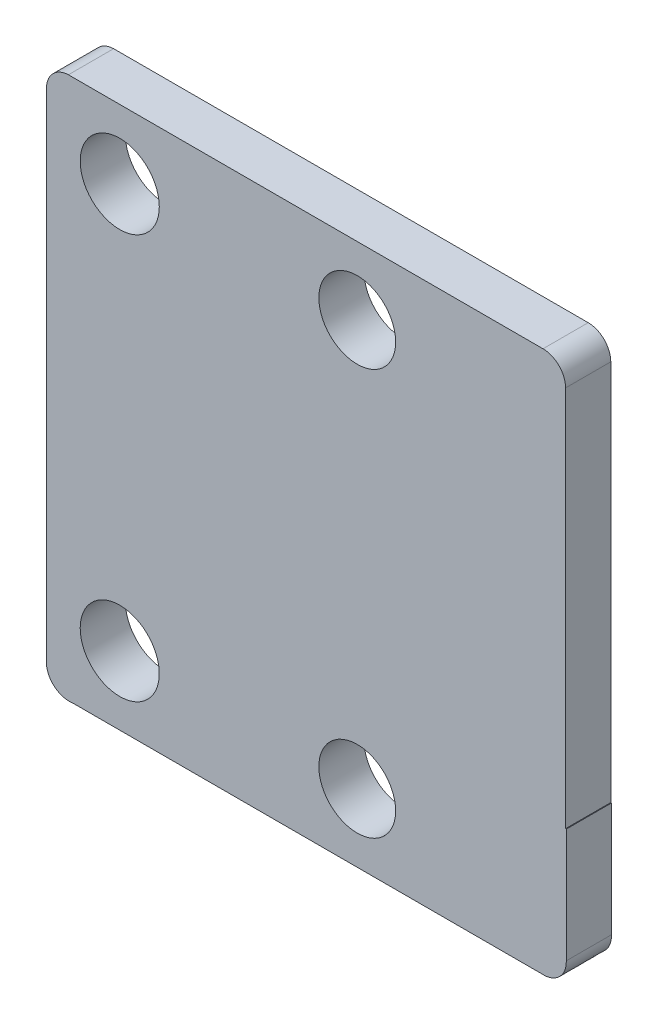
ISO-10303-21;
HEADER;
FILE_DESCRIPTION(('STEP AP214'),'2;1');
FILE_NAME('part.step','',(''),(''),'','','');
FILE_SCHEMA(('AUTOMOTIVE_DESIGN { 1 0 10303 214 1 1 1 1 }'));
ENDSEC;
DATA;
#1=APPLICATION_CONTEXT('core data for automotive mechanical design processes');
#2=APPLICATION_PROTOCOL_DEFINITION('international standard','automotive_design',2000,#1);
#3=PRODUCT_CONTEXT('',#1,'mechanical');
#4=PRODUCT('Part','Part','',(#3));
#5=PRODUCT_RELATED_PRODUCT_CATEGORY('part','',(#4));
#6=PRODUCT_DEFINITION_FORMATION('','',#4);
#7=PRODUCT_DEFINITION_CONTEXT('part definition',#1,'design');
#8=PRODUCT_DEFINITION('design','',#6,#7);
#9=PRODUCT_DEFINITION_SHAPE('','',#8);
#10=(LENGTH_UNIT() NAMED_UNIT(*) SI_UNIT(.MILLI.,.METRE.));
#11=(NAMED_UNIT(*) PLANE_ANGLE_UNIT() SI_UNIT($,.RADIAN.));
#12=(NAMED_UNIT(*) SI_UNIT($,.STERADIAN.) SOLID_ANGLE_UNIT());
#13=UNCERTAINTY_MEASURE_WITH_UNIT(LENGTH_MEASURE(1.E-05),#10,'distance_accuracy_value','');
#14=(GEOMETRIC_REPRESENTATION_CONTEXT(3) GLOBAL_UNCERTAINTY_ASSIGNED_CONTEXT((#13)) GLOBAL_UNIT_ASSIGNED_CONTEXT((#10,
#11,#12)) REPRESENTATION_CONTEXT('',''));
#15=CARTESIAN_POINT('',(0.,0.,0.));
#16=DIRECTION('',(0.,0.,1.));
#17=DIRECTION('',(1.,0.,0.));
#18=AXIS2_PLACEMENT_3D('',#15,#16,#17);
#19=CARTESIAN_POINT('',(3.38796219903326,76.09692360159,2.));
#20=DIRECTION('',(0.,0.,-1.));
#21=DIRECTION('',(-1.,0.,0.));
#22=AXIS2_PLACEMENT_3D('',#19,#20,#21);
#23=PLANE('',#22);
#24=CARTESIAN_POINT('',(4.13111112201128,75.9013919559706,2.));
#25=CARTESIAN_POINT('',(3.99969238475071,75.8828748631434,2.));
#26=CARTESIAN_POINT('',(3.86699746059071,75.8909909502416,2.));
#27=CARTESIAN_POINT('',(3.61249117013596,75.9581464715832,2.));
#28=CARTESIAN_POINT('',(3.49205618357225,76.0173859697303,2.));
#29=CARTESIAN_POINT('',(3.28386821449427,76.1764612334496,2.));
#30=CARTESIAN_POINT('',(3.19480496690169,76.2775755298951,2.));
#31=CARTESIAN_POINT('',(3.06289000640243,76.5035715896642,2.));
#32=CARTESIAN_POINT('',(3.01849844248715,76.6305174648622,2.));
#33=CARTESIAN_POINT('',(2.99998642645625,76.7619001712909,2.));
#34=B_SPLINE_CURVE_WITH_KNOTS('',3,(#24,#25,#26,#27,#28,#29,#30,#31,#32,#33),.UNSPECIFIED.,.F.,
.F.,(4,2,2,2,4),(0.,0.250000000000002,0.500000000000005,0.750000000000002,1.),.UNSPECIFIED.);
#35=CARTESIAN_POINT('',(2.99998642645625,76.7619001712909,2.));
#36=VERTEX_POINT('',#35);
#37=CARTESIAN_POINT('',(4.13111112201128,75.9013919559706,2.));
#38=VERTEX_POINT('',#37);
#39=EDGE_CURVE('E222',#36,#38,#34,.F.);
#40=ORIENTED_EDGE('',*,*,#39,.T.);
#41=DIRECTION('',(0.999999999999774,-6.72708715970015E-07,0.));
#42=VECTOR('',#41,1.);
#43=CARTESIAN_POINT('',(4.13111112201128,75.9013919559706,2.));
#44=LINE('',#43,#42);
#45=CARTESIAN_POINT('',(25.0323437963,75.9013778955292,2.));
#46=VERTEX_POINT('',#45);
#47=EDGE_CURVE('E111',#38,#46,#44,.T.);
#48=ORIENTED_EDGE('',*,*,#47,.T.);
#49=CARTESIAN_POINT('',(25.9999865478393,76.9423317710307,2.));
#50=CARTESIAN_POINT('',(26.0041729084957,76.8096950741571,2.));
#51=CARTESIAN_POINT('',(25.9826189370078,76.6787825227222,2.));
#52=CARTESIAN_POINT('',(25.8908073271444,76.4318223926162,2.));
#53=CARTESIAN_POINT('',(25.8206917841465,76.3176968614532,2.));
#54=CARTESIAN_POINT('',(25.5537117648207,76.0288568164609,2.));
#55=CARTESIAN_POINT('',(25.2976920535846,75.9097529797314,2.));
#56=CARTESIAN_POINT('',(25.0323437963,75.9013778955292,2.));
#57=B_SPLINE_CURVE_WITH_KNOTS('',3,(#49,#50,#51,#52,#53,#54,#55,#56),.UNSPECIFIED.,.F.,.F.,(4,2,
2,4),(0.,0.25,0.5,1.),.UNSPECIFIED.);
#58=CARTESIAN_POINT('',(25.9999865478393,76.9423317710307,2.));
#59=VERTEX_POINT('',#58);
#60=EDGE_CURVE('E185',#46,#59,#57,.F.);
#61=ORIENTED_EDGE('',*,*,#60,.T.);
#62=DIRECTION('',(6.72708715570576E-07,0.999999999999774,0.));
#63=VECTOR('',#62,1.);
#64=CARTESIAN_POINT('',(25.9999865478393,76.9423317710307,2.));
#65=LINE('',#64,#63);
#66=CARTESIAN_POINT('',(25.9999899447888,81.9919905042394,2.));
#67=VERTEX_POINT('',#66);
#68=EDGE_CURVE('E260',#59,#67,#65,.T.);
#69=ORIENTED_EDGE('',*,*,#68,.T.);
#70=DIRECTION('',(-0.999999988802901,-0.000149646911254807,0.));
#71=VECTOR('',#70,1.);
#72=CARTESIAN_POINT('',(25.9999899447888,81.9919905042394,2.));
#73=LINE('',#72,#71);
#74=CARTESIAN_POINT('',(25.9695999415119,81.9919859564692,2.));
#75=VERTEX_POINT('',#74);
#76=EDGE_CURVE('E276',#67,#75,#73,.T.);
#77=ORIENTED_EDGE('',*,*,#76,.T.);
#78=DIRECTION('',(0.,1.,0.));
#79=VECTOR('',#78,1.);
#80=CARTESIAN_POINT('',(25.9695999415119,81.9919859564692,2.));
#81=LINE('',#80,#79);
#82=CARTESIAN_POINT('',(25.9695999415119,98.8823008252965,2.));
#83=VERTEX_POINT('',#82);
#84=EDGE_CURVE('E313',#75,#83,#81,.T.);
#85=ORIENTED_EDGE('',*,*,#84,.T.);
#86=CARTESIAN_POINT('',(24.9695999415119,98.8823008252965,2.));
#87=DIRECTION('',(0.,0.,1.));
#88=DIRECTION('',(1.,0.,0.));
#89=AXIS2_PLACEMENT_3D('',#86,#87,#88);
#90=CIRCLE('',#89,1.);
#91=CARTESIAN_POINT('',(24.9695999415119,99.8823008252965,2.));
#92=VERTEX_POINT('',#91);
#93=EDGE_CURVE('E315',#83,#92,#90,.T.);
#94=ORIENTED_EDGE('',*,*,#93,.T.);
#95=DIRECTION('',(-1.,0.,0.));
#96=VECTOR('',#95,1.);
#97=CARTESIAN_POINT('',(24.9695999415119,99.8823008252965,2.));
#98=LINE('',#97,#96);
#99=CARTESIAN_POINT('',(3.96959994151188,99.8823008252966,2.));
#100=VERTEX_POINT('',#99);
#101=EDGE_CURVE('E139',#92,#100,#98,.T.);
#102=ORIENTED_EDGE('',*,*,#101,.T.);
#103=CARTESIAN_POINT('',(3.99998994246822,98.8827627080435,2.));
#104=DIRECTION('',(0.,0.,1.));
#105=DIRECTION('',(1.,0.,0.));
#106=AXIS2_PLACEMENT_3D('',#103,#104,#105);
#107=CIRCLE('',#106,1.);
#108=CARTESIAN_POINT('',(2.99998994246822,98.8827627080435,2.));
#109=VERTEX_POINT('',#108);
#110=EDGE_CURVE('E133',#100,#109,#107,.T.);
#111=ORIENTED_EDGE('',*,*,#110,.T.);
#112=DIRECTION('',(0.,-1.,0.));
#113=VECTOR('',#112,1.);
#114=CARTESIAN_POINT('',(2.99998994246822,98.8827627080435,2.));
#115=LINE('',#114,#113);
#116=CARTESIAN_POINT('',(2.99998994246822,81.9885486252381,2.));
#117=VERTEX_POINT('',#116);
#118=EDGE_CURVE('E137',#109,#117,#115,.T.);
#119=ORIENTED_EDGE('',*,*,#118,.T.);
#120=DIRECTION('',(-6.72708715473246E-07,-0.999999999999774,0.));
#121=VECTOR('',#120,1.);
#122=CARTESIAN_POINT('',(2.99998994246822,81.9885486252381,2.));
#123=LINE('',#122,#121);
#124=EDGE_CURVE('E59',#117,#36,#123,.T.);
#125=ORIENTED_EDGE('',*,*,#124,.T.);
#126=EDGE_LOOP('',(#40,#48,#61,#69,#77,#85,#94,#102,#111,#119,#125));
#127=FACE_BOUND('',#126,.T.);
#128=CARTESIAN_POINT('',(6.24052422757774,96.8357479782727,2.));
#129=DIRECTION('',(0.,0.,1.));
#130=DIRECTION('',(1.,0.,0.));
#131=AXIS2_PLACEMENT_3D('',#128,#129,#130);
#132=CIRCLE('',#131,1.75);
#133=CARTESIAN_POINT('',(7.99052422757774,96.8357479782727,2.));
#134=VERTEX_POINT('',#133);
#135=EDGE_CURVE('E352',#134,#134,#132,.T.);
#136=ORIENTED_EDGE('',*,*,#135,.F.);
#137=EDGE_LOOP('',(#136));
#138=FACE_BOUND('',#137,.T.);
#139=CARTESIAN_POINT('',(16.7499878726049,78.9116353634278,2.));
#140=DIRECTION('',(0.,0.,1.));
#141=DIRECTION('',(1.,0.,0.));
#142=AXIS2_PLACEMENT_3D('',#139,#140,#141);
#143=CIRCLE('',#142,1.7);
#144=CARTESIAN_POINT('',(18.4499878726049,78.9116353634278,2.));
#145=VERTEX_POINT('',#144);
#146=EDGE_CURVE('E359',#145,#145,#143,.T.);
#147=ORIENTED_EDGE('',*,*,#146,.F.);
#148=EDGE_LOOP('',(#147));
#149=FACE_BOUND('',#148,.T.);
#150=CARTESIAN_POINT('',(16.7499999583167,96.8773781491711,2.));
#151=DIRECTION('',(0.,0.,1.));
#152=DIRECTION('',(1.,0.,0.));
#153=AXIS2_PLACEMENT_3D('',#150,#151,#152);
#154=CIRCLE('',#153,1.69999999999529);
#155=CARTESIAN_POINT('',(18.449999958312,96.8773781491711,2.));
#156=VERTEX_POINT('',#155);
#157=EDGE_CURVE('E364',#156,#156,#154,.T.);
#158=ORIENTED_EDGE('',*,*,#157,.F.);
#159=EDGE_LOOP('',(#158));
#160=FACE_BOUND('',#159,.T.);
#161=CARTESIAN_POINT('',(6.24052422757774,78.9415338954738,2.));
#162=DIRECTION('',(0.,0.,1.));
#163=DIRECTION('',(-1.,0.,0.));
#164=AXIS2_PLACEMENT_3D('',#161,#162,#163);
#165=CIRCLE('',#164,1.75);
#166=CARTESIAN_POINT('',(4.49052422757774,78.9415338954738,2.));
#167=VERTEX_POINT('',#166);
#168=EDGE_CURVE('E370',#167,#167,#165,.T.);
#169=ORIENTED_EDGE('',*,*,#168,.F.);
#170=EDGE_LOOP('',(#169));
#171=FACE_BOUND('',#170,.T.);
#172=ADVANCED_FACE('F38',(#127,#138,#149,#160,#171),#23,.F.);
#173=CARTESIAN_POINT('',(3.38796219903326,76.09692360159,0.));
#174=DIRECTION('',(0.,0.,-1.));
#175=DIRECTION('',(-1.,0.,0.));
#176=AXIS2_PLACEMENT_3D('',#173,#174,#175);
#177=PLANE('',#176);
#178=CARTESIAN_POINT('',(16.7499999583167,96.8773781491711,0.));
#179=DIRECTION('',(0.,0.,1.));
#180=DIRECTION('',(1.,0.,0.));
#181=AXIS2_PLACEMENT_3D('',#178,#179,#180);
#182=CIRCLE('',#181,1.69999999999529);
#183=CARTESIAN_POINT('',(18.449999958312,96.8773781491711,0.));
#184=VERTEX_POINT('',#183);
#185=EDGE_CURVE('E367',#184,#184,#182,.T.);
#186=ORIENTED_EDGE('',*,*,#185,.T.);
#187=EDGE_LOOP('',(#186));
#188=FACE_BOUND('',#187,.T.);
#189=CARTESIAN_POINT('',(6.24052422757774,96.8357479782727,0.));
#190=DIRECTION('',(0.,0.,1.));
#191=DIRECTION('',(1.,0.,0.));
#192=AXIS2_PLACEMENT_3D('',#189,#190,#191);
#193=CIRCLE('',#192,1.75);
#194=CARTESIAN_POINT('',(7.99052422757774,96.8357479782727,0.));
#195=VERTEX_POINT('',#194);
#196=EDGE_CURVE('E354',#195,#195,#193,.T.);
#197=ORIENTED_EDGE('',*,*,#196,.T.);
#198=EDGE_LOOP('',(#197));
#199=FACE_BOUND('',#198,.T.);
#200=CARTESIAN_POINT('',(2.99998642645625,76.7619001712909,0.));
#201=CARTESIAN_POINT('',(3.01849844248715,76.6305174648622,0.));
#202=CARTESIAN_POINT('',(3.06289000640243,76.5035715896642,0.));
#203=CARTESIAN_POINT('',(3.19480496690169,76.2775755298951,0.));
#204=CARTESIAN_POINT('',(3.28386821449427,76.1764612334496,0.));
#205=CARTESIAN_POINT('',(3.49205618357225,76.0173859697303,0.));
#206=CARTESIAN_POINT('',(3.61249117013596,75.9581464715832,0.));
#207=CARTESIAN_POINT('',(3.86699746059071,75.8909909502416,0.));
#208=CARTESIAN_POINT('',(3.99969238475071,75.8828748631434,0.));
#209=CARTESIAN_POINT('',(4.13111112201128,75.9013919559706,0.));
#210=B_SPLINE_CURVE_WITH_KNOTS('',3,(#200,#201,#202,#203,#204,#205,#206,#207,#208,#209),
.UNSPECIFIED.,.F.,.F.,(4,2,2,2,4),(0.,0.249999999999998,0.499999999999995,0.749999999999998,1.),.UNSPECIFIED.);
#211=CARTESIAN_POINT('',(2.99998642645625,76.7619001712909,0.));
#212=VERTEX_POINT('',#211);
#213=CARTESIAN_POINT('',(4.13111112201128,75.9013919559706,0.));
#214=VERTEX_POINT('',#213);
#215=EDGE_CURVE('E241',#212,#214,#210,.T.);
#216=ORIENTED_EDGE('',*,*,#215,.F.);
#217=DIRECTION('',(-6.72708715473246E-07,-0.999999999999774,0.));
#218=VECTOR('',#217,1.);
#219=CARTESIAN_POINT('',(2.99998994246822,81.9885486252381,0.));
#220=LINE('',#219,#218);
#221=CARTESIAN_POINT('',(2.99998994246822,81.9885486252381,0.));
#222=VERTEX_POINT('',#221);
#223=EDGE_CURVE('E103',#222,#212,#220,.T.);
#224=ORIENTED_EDGE('',*,*,#223,.F.);
#225=DIRECTION('',(0.,-1.,0.));
#226=VECTOR('',#225,1.);
#227=CARTESIAN_POINT('',(2.99998994246822,98.8827627080435,0.));
#228=LINE('',#227,#226);
#229=CARTESIAN_POINT('',(2.99998994246822,98.8827627080435,0.));
#230=VERTEX_POINT('',#229);
#231=EDGE_CURVE('E97',#230,#222,#228,.T.);
#232=ORIENTED_EDGE('',*,*,#231,.F.);
#233=CARTESIAN_POINT('',(3.99998994246822,98.8827627080435,0.));
#234=DIRECTION('',(0.,0.,1.));
#235=DIRECTION('',(1.,0.,0.));
#236=AXIS2_PLACEMENT_3D('',#233,#234,#235);
#237=CIRCLE('',#236,1.);
#238=CARTESIAN_POINT('',(3.96959994151188,99.8823008252966,0.));
#239=VERTEX_POINT('',#238);
#240=EDGE_CURVE('E147',#239,#230,#237,.T.);
#241=ORIENTED_EDGE('',*,*,#240,.F.);
#242=DIRECTION('',(-1.,0.,0.));
#243=VECTOR('',#242,1.);
#244=CARTESIAN_POINT('',(24.9695999415119,99.8823008252965,0.));
#245=LINE('',#244,#243);
#246=CARTESIAN_POINT('',(24.9695999415119,99.8823008252965,0.));
#247=VERTEX_POINT('',#246);
#248=EDGE_CURVE('E164',#247,#239,#245,.T.);
#249=ORIENTED_EDGE('',*,*,#248,.F.);
#250=CARTESIAN_POINT('',(24.9695999415119,98.8823008252965,0.));
#251=DIRECTION('',(0.,0.,1.));
#252=DIRECTION('',(1.,0.,0.));
#253=AXIS2_PLACEMENT_3D('',#250,#251,#252);
#254=CIRCLE('',#253,1.);
#255=CARTESIAN_POINT('',(25.9695999415119,98.8823008252965,0.));
#256=VERTEX_POINT('',#255);
#257=EDGE_CURVE('E162',#256,#247,#254,.T.);
#258=ORIENTED_EDGE('',*,*,#257,.F.);
#259=DIRECTION('',(0.,1.,0.));
#260=VECTOR('',#259,1.);
#261=CARTESIAN_POINT('',(25.9695999415119,81.9919859564692,0.));
#262=LINE('',#261,#260);
#263=CARTESIAN_POINT('',(25.9695999415119,81.9919859564692,0.));
#264=VERTEX_POINT('',#263);
#265=EDGE_CURVE('E159',#264,#256,#262,.T.);
#266=ORIENTED_EDGE('',*,*,#265,.F.);
#267=DIRECTION('',(-0.999999988802901,-0.000149646911254807,0.));
#268=VECTOR('',#267,1.);
#269=CARTESIAN_POINT('',(25.9999899447888,81.9919905042394,0.));
#270=LINE('',#269,#268);
#271=CARTESIAN_POINT('',(25.9999899447888,81.9919905042394,0.));
#272=VERTEX_POINT('',#271);
#273=EDGE_CURVE('E157',#272,#264,#270,.T.);
#274=ORIENTED_EDGE('',*,*,#273,.F.);
#275=DIRECTION('',(6.72708715570576E-07,0.999999999999774,0.));
#276=VECTOR('',#275,1.);
#277=CARTESIAN_POINT('',(25.9999865478393,76.9423317710307,0.));
#278=LINE('',#277,#276);
#279=CARTESIAN_POINT('',(25.9999865478393,76.9423317710307,0.));
#280=VERTEX_POINT('',#279);
#281=EDGE_CURVE('E160',#280,#272,#278,.T.);
#282=ORIENTED_EDGE('',*,*,#281,.F.);
#283=CARTESIAN_POINT('',(25.0323437963,75.9013778955292,0.));
#284=CARTESIAN_POINT('',(25.2976920535846,75.9097529797314,0.));
#285=CARTESIAN_POINT('',(25.5537117648207,76.0288568164609,0.));
#286=CARTESIAN_POINT('',(25.8206917841465,76.3176968614532,0.));
#287=CARTESIAN_POINT('',(25.8908073271444,76.4318223926162,0.));
#288=CARTESIAN_POINT('',(25.9826189370078,76.6787825227222,0.));
#289=CARTESIAN_POINT('',(26.0041729084957,76.8096950741571,0.));
#290=CARTESIAN_POINT('',(25.9999865478393,76.9423317710307,0.));
#291=B_SPLINE_CURVE_WITH_KNOTS('',3,(#283,#284,#285,#286,#287,#288,#289,#290),.UNSPECIFIED.,.F.,
.F.,(4,2,2,4),(0.,0.5,0.75,1.),.UNSPECIFIED.);
#292=CARTESIAN_POINT('',(25.0323437963,75.9013778955292,0.));
#293=VERTEX_POINT('',#292);
#294=EDGE_CURVE('E282',#293,#280,#291,.T.);
#295=ORIENTED_EDGE('',*,*,#294,.F.);
#296=DIRECTION('',(0.999999999999774,-6.72708715970015E-07,0.));
#297=VECTOR('',#296,1.);
#298=CARTESIAN_POINT('',(4.13111112201128,75.9013919559706,0.));
#299=LINE('',#298,#297);
#300=EDGE_CURVE('E340',#214,#293,#299,.T.);
#301=ORIENTED_EDGE('',*,*,#300,.F.);
#302=EDGE_LOOP('',(#216,#224,#232,#241,#249,#258,#266,#274,#282,#295,#301));
#303=FACE_BOUND('',#302,.T.);
#304=CARTESIAN_POINT('',(16.7499878726049,78.9116353634278,0.));
#305=DIRECTION('',(0.,0.,1.));
#306=DIRECTION('',(1.,0.,0.));
#307=AXIS2_PLACEMENT_3D('',#304,#305,#306);
#308=CIRCLE('',#307,1.7);
#309=CARTESIAN_POINT('',(18.4499878726049,78.9116353634278,0.));
#310=VERTEX_POINT('',#309);
#311=EDGE_CURVE('E361',#310,#310,#308,.T.);
#312=ORIENTED_EDGE('',*,*,#311,.T.);
#313=EDGE_LOOP('',(#312));
#314=FACE_BOUND('',#313,.T.);
#315=CARTESIAN_POINT('',(6.24052422757774,78.9415338954738,0.));
#316=DIRECTION('',(0.,0.,1.));
#317=DIRECTION('',(-1.,0.,0.));
#318=AXIS2_PLACEMENT_3D('',#315,#316,#317);
#319=CIRCLE('',#318,1.75);
#320=CARTESIAN_POINT('',(4.49052422757774,78.9415338954738,0.));
#321=VERTEX_POINT('',#320);
#322=EDGE_CURVE('E373',#321,#321,#319,.T.);
#323=ORIENTED_EDGE('',*,*,#322,.T.);
#324=EDGE_LOOP('',(#323));
#325=FACE_BOUND('',#324,.T.);
#326=ADVANCED_FACE('F201',(#188,#199,#303,#314,#325),#177,.T.);
#327=CARTESIAN_POINT('',(2.99998642645625,76.7619001712909,2.));
#328=CARTESIAN_POINT('',(3.01849844248715,76.6305174648622,2.));
#329=CARTESIAN_POINT('',(3.06289000640243,76.5035715896642,2.));
#330=CARTESIAN_POINT('',(3.19480496690169,76.2775755298951,2.));
#331=CARTESIAN_POINT('',(3.28386821449427,76.1764612334496,2.));
#332=CARTESIAN_POINT('',(3.49205618357225,76.0173859697303,2.));
#333=CARTESIAN_POINT('',(3.61249117013596,75.9581464715832,2.));
#334=CARTESIAN_POINT('',(3.86699746059071,75.8909909502416,2.));
#335=CARTESIAN_POINT('',(3.99969238475071,75.8828748631434,2.));
#336=CARTESIAN_POINT('',(4.13111112201128,75.9013919559706,2.));
#337=B_SPLINE_CURVE_WITH_KNOTS('',3,(#327,#328,#329,#330,#331,#332,#333,#334,#335,#336),
.UNSPECIFIED.,.F.,.F.,(4,2,2,2,4),(0.,0.249999999999998,0.499999999999995,0.749999999999998,1.),.UNSPECIFIED.);
#338=DIRECTION('',(0.,0.,-1.));
#339=VECTOR('',#338,1.);
#340=SURFACE_OF_LINEAR_EXTRUSION('',#337,#339);
#341=ORIENTED_EDGE('',*,*,#215,.T.);
#342=DIRECTION('',(0.,0.,-1.));
#343=VECTOR('',#342,1.);
#344=CARTESIAN_POINT('',(4.13111112201128,75.9013919559706,2.));
#345=LINE('',#344,#343);
#346=EDGE_CURVE('E11',#38,#214,#345,.T.);
#347=ORIENTED_EDGE('',*,*,#346,.F.);
#348=ORIENTED_EDGE('',*,*,#39,.F.);
#349=DIRECTION('',(0.,0.,-1.));
#350=VECTOR('',#349,1.);
#351=CARTESIAN_POINT('',(2.99998642645625,76.7619001712909,2.));
#352=LINE('',#351,#350);
#353=EDGE_CURVE('E153',#36,#212,#352,.T.);
#354=ORIENTED_EDGE('',*,*,#353,.T.);
#355=EDGE_LOOP('',(#341,#347,#348,#354));
#356=FACE_BOUND('',#355,.T.);
#357=ADVANCED_FACE('F40',(#356),#340,.F.);
#358=CARTESIAN_POINT('',(4.13111112201128,75.9013919559706,2.));
#359=DIRECTION('',(6.72708715970015E-07,0.999999999999774,0.));
#360=DIRECTION('',(-0.999999999999774,6.72708715970015E-07,0.));
#361=AXIS2_PLACEMENT_3D('',#358,#359,#360);
#362=PLANE('',#361);
#363=ORIENTED_EDGE('',*,*,#300,.T.);
#364=DIRECTION('',(0.,0.,-1.));
#365=VECTOR('',#364,1.);
#366=CARTESIAN_POINT('',(25.0323437963,75.9013778955292,2.));
#367=LINE('',#366,#365);
#368=EDGE_CURVE('E50',#46,#293,#367,.T.);
#369=ORIENTED_EDGE('',*,*,#368,.F.);
#370=ORIENTED_EDGE('',*,*,#47,.F.);
#371=ORIENTED_EDGE('',*,*,#346,.T.);
#372=EDGE_LOOP('',(#363,#369,#370,#371));
#373=FACE_BOUND('',#372,.T.);
#374=ADVANCED_FACE('F298',(#373),#362,.F.);
#375=CARTESIAN_POINT('',(25.0323437963,75.9013778955292,2.));
#376=CARTESIAN_POINT('',(25.2976920535846,75.9097529797314,2.));
#377=CARTESIAN_POINT('',(25.5537117648207,76.0288568164609,2.));
#378=CARTESIAN_POINT('',(25.8206917841465,76.3176968614532,2.));
#379=CARTESIAN_POINT('',(25.8908073271444,76.4318223926162,2.));
#380=CARTESIAN_POINT('',(25.9826189370078,76.6787825227222,2.));
#381=CARTESIAN_POINT('',(26.0041729084957,76.8096950741571,2.));
#382=CARTESIAN_POINT('',(25.9999865478393,76.9423317710307,2.));
#383=B_SPLINE_CURVE_WITH_KNOTS('',3,(#375,#376,#377,#378,#379,#380,#381,#382),.UNSPECIFIED.,.F.,
.F.,(4,2,2,4),(0.,0.5,0.75,1.),.UNSPECIFIED.);
#384=DIRECTION('',(0.,0.,-1.));
#385=VECTOR('',#384,1.);
#386=SURFACE_OF_LINEAR_EXTRUSION('',#383,#385);
#387=ORIENTED_EDGE('',*,*,#294,.T.);
#388=DIRECTION('',(0.,0.,-1.));
#389=VECTOR('',#388,1.);
#390=CARTESIAN_POINT('',(25.9999865478393,76.9423317710307,2.));
#391=LINE('',#390,#389);
#392=EDGE_CURVE('E182',#59,#280,#391,.T.);
#393=ORIENTED_EDGE('',*,*,#392,.F.);
#394=ORIENTED_EDGE('',*,*,#60,.F.);
#395=ORIENTED_EDGE('',*,*,#368,.T.);
#396=EDGE_LOOP('',(#387,#393,#394,#395));
#397=FACE_BOUND('',#396,.T.);
#398=ADVANCED_FACE('F287',(#397),#386,.F.);
#399=CARTESIAN_POINT('',(25.9999865478393,76.9423317710307,2.));
#400=DIRECTION('',(-0.999999999999774,6.72708715570576E-07,0.));
#401=DIRECTION('',(-6.72708715570576E-07,-0.999999999999774,0.));
#402=AXIS2_PLACEMENT_3D('',#399,#400,#401);
#403=PLANE('',#402);
#404=ORIENTED_EDGE('',*,*,#281,.T.);
#405=DIRECTION('',(0.,0.,-1.));
#406=VECTOR('',#405,1.);
#407=CARTESIAN_POINT('',(25.9999899447888,81.9919905042394,2.));
#408=LINE('',#407,#406);
#409=EDGE_CURVE('E179',#67,#272,#408,.T.);
#410=ORIENTED_EDGE('',*,*,#409,.F.);
#411=ORIENTED_EDGE('',*,*,#68,.F.);
#412=ORIENTED_EDGE('',*,*,#392,.T.);
#413=EDGE_LOOP('',(#404,#410,#411,#412));
#414=FACE_BOUND('',#413,.T.);
#415=ADVANCED_FACE('F297',(#414),#403,.F.);
#416=CARTESIAN_POINT('',(25.9999899447888,81.9919905042394,2.));
#417=DIRECTION('',(0.000149646911254807,-0.999999988802901,0.));
#418=DIRECTION('',(0.999999988802901,0.000149646911254807,0.));
#419=AXIS2_PLACEMENT_3D('',#416,#417,#418);
#420=PLANE('',#419);
#421=ORIENTED_EDGE('',*,*,#273,.T.);
#422=DIRECTION('',(0.,0.,-1.));
#423=VECTOR('',#422,1.);
#424=CARTESIAN_POINT('',(25.9695999415119,81.9919859564692,2.));
#425=LINE('',#424,#423);
#426=EDGE_CURVE('E176',#75,#264,#425,.T.);
#427=ORIENTED_EDGE('',*,*,#426,.F.);
#428=ORIENTED_EDGE('',*,*,#76,.F.);
#429=ORIENTED_EDGE('',*,*,#409,.T.);
#430=EDGE_LOOP('',(#421,#427,#428,#429));
#431=FACE_BOUND('',#430,.T.);
#432=ADVANCED_FACE('F335',(#431),#420,.F.);
#433=CARTESIAN_POINT('',(25.9695999415119,81.9919859564692,2.));
#434=DIRECTION('',(-1.,0.,0.));
#435=DIRECTION('',(0.,0.,1.));
#436=AXIS2_PLACEMENT_3D('',#433,#434,#435);
#437=PLANE('',#436);
#438=ORIENTED_EDGE('',*,*,#265,.T.);
#439=DIRECTION('',(0.,0.,-1.));
#440=VECTOR('',#439,1.);
#441=CARTESIAN_POINT('',(25.9695999415119,98.8823008252965,2.));
#442=LINE('',#441,#440);
#443=EDGE_CURVE('E173',#83,#256,#442,.T.);
#444=ORIENTED_EDGE('',*,*,#443,.F.);
#445=ORIENTED_EDGE('',*,*,#84,.F.);
#446=ORIENTED_EDGE('',*,*,#426,.T.);
#447=EDGE_LOOP('',(#438,#444,#445,#446));
#448=FACE_BOUND('',#447,.T.);
#449=ADVANCED_FACE('F331',(#448),#437,.F.);
#450=CARTESIAN_POINT('',(24.9695999415119,98.8823008252965,2.));
#451=DIRECTION('',(0.,0.,-1.));
#452=DIRECTION('',(-1.,0.,0.));
#453=AXIS2_PLACEMENT_3D('',#450,#451,#452);
#454=CYLINDRICAL_SURFACE('',#453,1.);
#455=ORIENTED_EDGE('',*,*,#257,.T.);
#456=DIRECTION('',(0.,0.,-1.));
#457=VECTOR('',#456,1.);
#458=CARTESIAN_POINT('',(24.9695999415119,99.8823008252965,2.));
#459=LINE('',#458,#457);
#460=EDGE_CURVE('E170',#92,#247,#459,.T.);
#461=ORIENTED_EDGE('',*,*,#460,.F.);
#462=ORIENTED_EDGE('',*,*,#93,.F.);
#463=ORIENTED_EDGE('',*,*,#443,.T.);
#464=EDGE_LOOP('',(#455,#461,#462,#463));
#465=FACE_BOUND('',#464,.T.);
#466=ADVANCED_FACE('F321',(#465),#454,.T.);
#467=CARTESIAN_POINT('',(24.9695999415119,99.8823008252965,2.));
#468=DIRECTION('',(0.,-1.,0.));
#469=DIRECTION('',(1.,0.,0.));
#470=AXIS2_PLACEMENT_3D('',#467,#468,#469);
#471=PLANE('',#470);
#472=ORIENTED_EDGE('',*,*,#248,.T.);
#473=DIRECTION('',(0.,0.,-1.));
#474=VECTOR('',#473,1.);
#475=CARTESIAN_POINT('',(3.96959994151188,99.8823008252966,2.));
#476=LINE('',#475,#474);
#477=EDGE_CURVE('E148',#100,#239,#476,.T.);
#478=ORIENTED_EDGE('',*,*,#477,.F.);
#479=ORIENTED_EDGE('',*,*,#101,.F.);
#480=ORIENTED_EDGE('',*,*,#460,.T.);
#481=EDGE_LOOP('',(#472,#478,#479,#480));
#482=FACE_BOUND('',#481,.T.);
#483=ADVANCED_FACE('F325',(#482),#471,.F.);
#484=CARTESIAN_POINT('',(3.99998994246822,98.8827627080435,2.));
#485=DIRECTION('',(0.,0.,-1.));
#486=DIRECTION('',(-1.,0.,0.));
#487=AXIS2_PLACEMENT_3D('',#484,#485,#486);
#488=CYLINDRICAL_SURFACE('',#487,1.);
#489=ORIENTED_EDGE('',*,*,#240,.T.);
#490=DIRECTION('',(0.,0.,-1.));
#491=VECTOR('',#490,1.);
#492=CARTESIAN_POINT('',(2.99998994246822,98.8827627080435,2.));
#493=LINE('',#492,#491);
#494=EDGE_CURVE('E144',#109,#230,#493,.T.);
#495=ORIENTED_EDGE('',*,*,#494,.F.);
#496=ORIENTED_EDGE('',*,*,#110,.F.);
#497=ORIENTED_EDGE('',*,*,#477,.T.);
#498=EDGE_LOOP('',(#489,#495,#496,#497));
#499=FACE_BOUND('',#498,.T.);
#500=ADVANCED_FACE('F145',(#499),#488,.T.);
#501=CARTESIAN_POINT('',(2.99998994246822,98.8827627080435,2.));
#502=DIRECTION('',(1.,0.,0.));
#503=DIRECTION('',(0.,1.,0.));
#504=AXIS2_PLACEMENT_3D('',#501,#502,#503);
#505=PLANE('',#504);
#506=ORIENTED_EDGE('',*,*,#231,.T.);
#507=DIRECTION('',(0.,0.,-1.));
#508=VECTOR('',#507,1.);
#509=CARTESIAN_POINT('',(2.99998994246822,81.9885486252381,2.));
#510=LINE('',#509,#508);
#511=EDGE_CURVE('E149',#117,#222,#510,.T.);
#512=ORIENTED_EDGE('',*,*,#511,.F.);
#513=ORIENTED_EDGE('',*,*,#118,.F.);
#514=ORIENTED_EDGE('',*,*,#494,.T.);
#515=EDGE_LOOP('',(#506,#512,#513,#514));
#516=FACE_BOUND('',#515,.T.);
#517=ADVANCED_FACE('F151',(#516),#505,.F.);
#518=CARTESIAN_POINT('',(2.99998994246822,81.9885486252381,2.));
#519=DIRECTION('',(0.999999999999774,-6.72708715473246E-07,0.));
#520=DIRECTION('',(6.72708715473246E-07,0.999999999999774,0.));
#521=AXIS2_PLACEMENT_3D('',#518,#519,#520);
#522=PLANE('',#521);
#523=ORIENTED_EDGE('',*,*,#223,.T.);
#524=ORIENTED_EDGE('',*,*,#353,.F.);
#525=ORIENTED_EDGE('',*,*,#124,.F.);
#526=ORIENTED_EDGE('',*,*,#511,.T.);
#527=EDGE_LOOP('',(#523,#524,#525,#526));
#528=FACE_BOUND('',#527,.T.);
#529=ADVANCED_FACE('F398',(#528),#522,.F.);
#530=CARTESIAN_POINT('',(6.24052422757774,96.8357479782727,2.));
#531=DIRECTION('',(0.,0.,-1.));
#532=DIRECTION('',(-1.,0.,0.));
#533=AXIS2_PLACEMENT_3D('',#530,#531,#532);
#534=CYLINDRICAL_SURFACE('',#533,1.75);
#535=ORIENTED_EDGE('',*,*,#135,.T.);
#536=EDGE_LOOP('',(#535));
#537=FACE_BOUND('',#536,.T.);
#538=ORIENTED_EDGE('',*,*,#196,.F.);
#539=EDGE_LOOP('',(#538));
#540=FACE_BOUND('',#539,.T.);
#541=ADVANCED_FACE('F202',(#537,#540),#534,.F.);
#542=CARTESIAN_POINT('',(16.7499878726049,78.9116353634278,2.));
#543=DIRECTION('',(0.,0.,-1.));
#544=DIRECTION('',(-1.,0.,0.));
#545=AXIS2_PLACEMENT_3D('',#542,#543,#544);
#546=CYLINDRICAL_SURFACE('',#545,1.7);
#547=ORIENTED_EDGE('',*,*,#146,.T.);
#548=EDGE_LOOP('',(#547));
#549=FACE_BOUND('',#548,.T.);
#550=ORIENTED_EDGE('',*,*,#311,.F.);
#551=EDGE_LOOP('',(#550));
#552=FACE_BOUND('',#551,.T.);
#553=ADVANCED_FACE('F397',(#549,#552),#546,.F.);
#554=CARTESIAN_POINT('',(16.7499999583167,96.8773781491711,2.));
#555=DIRECTION('',(0.,0.,-1.));
#556=DIRECTION('',(-1.,0.,0.));
#557=AXIS2_PLACEMENT_3D('',#554,#555,#556);
#558=CYLINDRICAL_SURFACE('',#557,1.69999999999529);
#559=ORIENTED_EDGE('',*,*,#157,.T.);
#560=EDGE_LOOP('',(#559));
#561=FACE_BOUND('',#560,.T.);
#562=ORIENTED_EDGE('',*,*,#185,.F.);
#563=EDGE_LOOP('',(#562));
#564=FACE_BOUND('',#563,.T.);
#565=ADVANCED_FACE('F383',(#561,#564),#558,.F.);
#566=CARTESIAN_POINT('',(6.24052422757774,78.9415338954738,2.));
#567=DIRECTION('',(0.,0.,-1.));
#568=DIRECTION('',(-1.,0.,0.));
#569=AXIS2_PLACEMENT_3D('',#566,#567,#568);
#570=CYLINDRICAL_SURFACE('',#569,1.75);
#571=ORIENTED_EDGE('',*,*,#168,.T.);
#572=EDGE_LOOP('',(#571));
#573=FACE_BOUND('',#572,.T.);
#574=ORIENTED_EDGE('',*,*,#322,.F.);
#575=EDGE_LOOP('',(#574));
#576=FACE_BOUND('',#575,.T.);
#577=ADVANCED_FACE('F379',(#573,#576),#570,.F.);
#578=CLOSED_SHELL('',(#172,#326,#357,#374,#398,#415,#432,#449,#466,#483,#500,#517,#529,#541,
#553,#565,#577));
#579=MANIFOLD_SOLID_BREP('B2',#578);
#580=ADVANCED_BREP_SHAPE_REPRESENTATION('',(#18,#579),#14);
#581=SHAPE_DEFINITION_REPRESENTATION(#9,#580);
ENDSEC;
END-ISO-10303-21;
